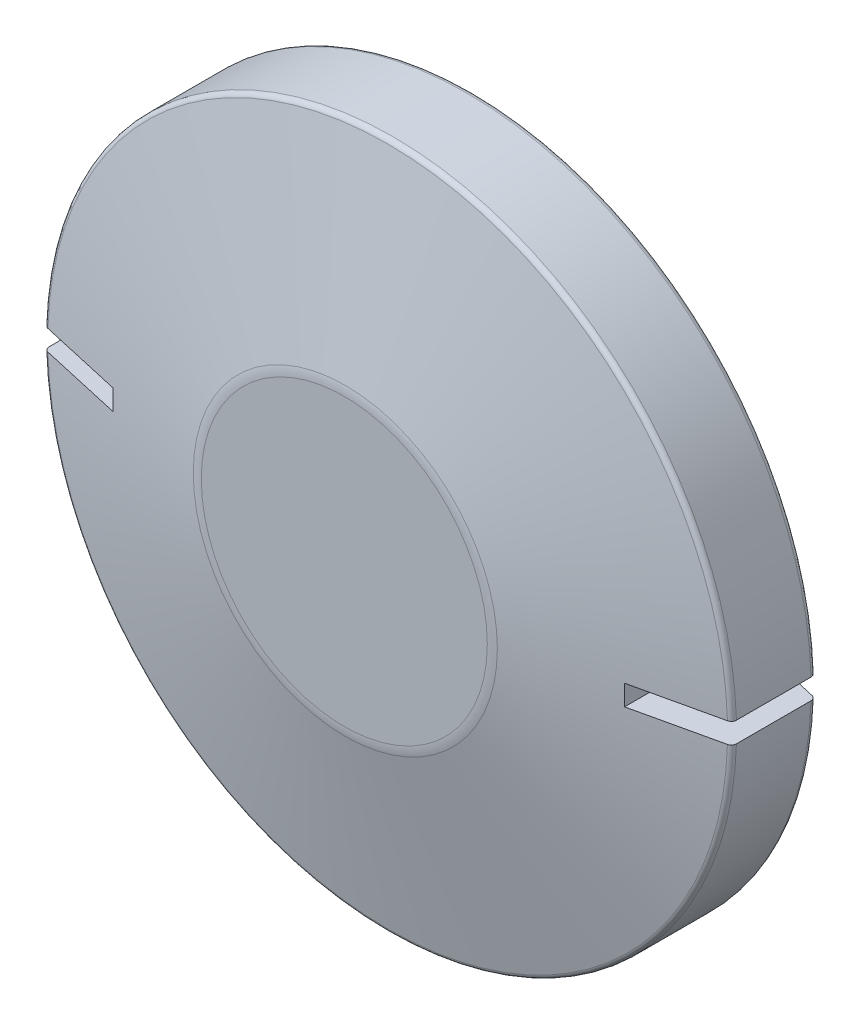
ISO-10303-21;
HEADER;
FILE_DESCRIPTION(('STEP AP214'),'2;1');
FILE_NAME('part.step','',(''),(''),'','','');
FILE_SCHEMA(('AUTOMOTIVE_DESIGN { 1 0 10303 214 1 1 1 1 }'));
ENDSEC;
DATA;
#1=APPLICATION_CONTEXT('core data for automotive mechanical design processes');
#2=APPLICATION_PROTOCOL_DEFINITION('international standard','automotive_design',2000,#1);
#3=PRODUCT_CONTEXT('',#1,'mechanical');
#4=PRODUCT('Part','Part','',(#3));
#5=PRODUCT_RELATED_PRODUCT_CATEGORY('part','',(#4));
#6=PRODUCT_DEFINITION_FORMATION('','',#4);
#7=PRODUCT_DEFINITION_CONTEXT('part definition',#1,'design');
#8=PRODUCT_DEFINITION('design','',#6,#7);
#9=PRODUCT_DEFINITION_SHAPE('','',#8);
#10=(LENGTH_UNIT() NAMED_UNIT(*) SI_UNIT(.MILLI.,.METRE.));
#11=(NAMED_UNIT(*) PLANE_ANGLE_UNIT() SI_UNIT($,.RADIAN.));
#12=(NAMED_UNIT(*) SI_UNIT($,.STERADIAN.) SOLID_ANGLE_UNIT());
#13=UNCERTAINTY_MEASURE_WITH_UNIT(LENGTH_MEASURE(1.E-05),#10,'distance_accuracy_value','');
#14=(GEOMETRIC_REPRESENTATION_CONTEXT(3) GLOBAL_UNCERTAINTY_ASSIGNED_CONTEXT((#13)) GLOBAL_UNIT_ASSIGNED_CONTEXT((#10,
#11,#12)) REPRESENTATION_CONTEXT('',''));
#15=CARTESIAN_POINT('',(0.,0.,0.));
#16=DIRECTION('',(0.,0.,1.));
#17=DIRECTION('',(1.,0.,0.));
#18=AXIS2_PLACEMENT_3D('',#15,#16,#17);
#19=CARTESIAN_POINT('',(-13.9901133160344,-13.9901133160344,16.8));
#20=DIRECTION('',(0.,0.,1.));
#21=DIRECTION('',(1.,0.,0.));
#22=AXIS2_PLACEMENT_3D('',#19,#20,#21);
#23=PLANE('',#22);
#24=CARTESIAN_POINT('',(0.,0.,16.8));
#25=DIRECTION('',(0.,0.,-1.));
#26=DIRECTION('',(-1.,0.,0.));
#27=AXIS2_PLACEMENT_3D('',#24,#25,#26);
#28=CIRCLE('',#27,13.9801133160344);
#29=CARTESIAN_POINT('',(-13.9801133160344,0.,16.8));
#30=VERTEX_POINT('',#29);
#31=EDGE_CURVE('E22',#30,#30,#28,.T.);
#32=ORIENTED_EDGE('',*,*,#31,.F.);
#33=EDGE_LOOP('',(#32));
#34=FACE_BOUND('',#33,.T.);
#35=ADVANCED_FACE('F17',(#34),#23,.T.);
#36=CARTESIAN_POINT('',(14.5457854044398,-14.5457854044398,0.));
#37=DIRECTION('',(0.,0.,-1.));
#38=DIRECTION('',(-1.,0.,0.));
#39=AXIS2_PLACEMENT_3D('',#36,#37,#38);
#40=PLANE('',#39);
#41=CARTESIAN_POINT('',(0.,0.,0.));
#42=DIRECTION('',(0.,0.,-1.));
#43=DIRECTION('',(-1.,0.,0.));
#44=AXIS2_PLACEMENT_3D('',#41,#42,#43);
#45=CIRCLE('',#44,14.5357854044398);
#46=CARTESIAN_POINT('',(-14.5357854044398,0.,0.));
#47=VERTEX_POINT('',#46);
#48=EDGE_CURVE('E244',#47,#47,#45,.F.);
#49=ORIENTED_EDGE('',*,*,#48,.F.);
#50=EDGE_LOOP('',(#49));
#51=FACE_BOUND('',#50,.T.);
#52=ADVANCED_FACE('F486',(#51),#40,.T.);
#53=CARTESIAN_POINT('',(-5.21128131041563E-13,5.74843991851814E-13,4.77559832415817));
#54=DIRECTION('',(0.,0.,1.));
#55=DIRECTION('',(1.,0.,0.));
#56=AXIS2_PLACEMENT_3D('',#53,#54,#55);
#57=CYLINDRICAL_SURFACE('',#56,33.6146574673766);
#58=DIRECTION('',(0.,0.,1.));
#59=VECTOR('',#58,1.);
#60=CARTESIAN_POINT('',(33.5997797108746,1.00000001489884,8.38355223928755));
#61=LINE('',#60,#59);
#62=CARTESIAN_POINT('',(33.5997797108741,1.00000001489884,4.77559832415817));
#63=VERTEX_POINT('',#62);
#64=CARTESIAN_POINT('',(33.5997797108741,1.00000001489884,12.070682298208));
#65=VERTEX_POINT('',#64);
#66=EDGE_CURVE('E256',#63,#65,#61,.T.);
#67=ORIENTED_EDGE('',*,*,#66,.F.);
#68=CARTESIAN_POINT('',(-5.21128131041563E-13,5.74843991851814E-13,4.77559832415817));
#69=DIRECTION('',(0.,0.,-1.));
#70=DIRECTION('',(-1.,0.,0.));
#71=AXIS2_PLACEMENT_3D('',#68,#69,#70);
#72=CIRCLE('',#71,33.6146574673766);
#73=CARTESIAN_POINT('',(-33.5997797108745,1.00000001490116,4.77559832415817));
#74=VERTEX_POINT('',#73);
#75=EDGE_CURVE('E232',#74,#63,#72,.T.);
#76=ORIENTED_EDGE('',*,*,#75,.F.);
#77=DIRECTION('',(0.,0.,-1.));
#78=VECTOR('',#77,1.);
#79=CARTESIAN_POINT('',(-33.5997797108745,1.00000001490116,8.38355223928751));
#80=LINE('',#79,#78);
#81=CARTESIAN_POINT('',(-33.5997797108745,1.00000001490116,12.070682298208));
#82=VERTEX_POINT('',#81);
#83=EDGE_CURVE('E233',#82,#74,#80,.T.);
#84=ORIENTED_EDGE('',*,*,#83,.F.);
#85=CARTESIAN_POINT('',(-5.21128131041563E-13,5.74843991851814E-13,12.070682298208));
#86=DIRECTION('',(0.,0.,1.));
#87=DIRECTION('',(0.,-1.,0.));
#88=AXIS2_PLACEMENT_3D('',#85,#86,#87);
#89=CIRCLE('',#88,33.6146574673766);
#90=EDGE_CURVE('E121',#65,#82,#89,.T.);
#91=ORIENTED_EDGE('',*,*,#90,.F.);
#92=EDGE_LOOP('',(#67,#76,#84,#91));
#93=FACE_BOUND('',#92,.T.);
#94=ADVANCED_FACE('F139',(#93),#57,.T.);
#95=CARTESIAN_POINT('',(25.0000003725464,1.01000001489884,2.34276110825747));
#96=DIRECTION('',(1.,0.,0.));
#97=DIRECTION('',(0.,0.,1.));
#98=AXIS2_PLACEMENT_3D('',#95,#96,#97);
#99=PLANE('',#98);
#100=DIRECTION('',(0.,0.,1.));
#101=VECTOR('',#100,1.);
#102=CARTESIAN_POINT('',(25.0000003725464,-1.00000001490116,8.38355223928755));
#103=LINE('',#102,#101);
#104=CARTESIAN_POINT('',(25.0000003725464,-1.00000001490116,2.35746474966421));
#105=VERTEX_POINT('',#104);
#106=CARTESIAN_POINT('',(25.0000003725464,-1.00000001490116,14.4096397289109));
#107=VERTEX_POINT('',#106);
#108=EDGE_CURVE('E116',#105,#107,#103,.T.);
#109=ORIENTED_EDGE('',*,*,#108,.F.);
#110=CARTESIAN_POINT('',(25.0000003725464,-1.00000001490116,2.35746474966421));
#111=CARTESIAN_POINT('',(25.0000003725464,-0.499800167287828,2.35276110825746));
#112=CARTESIAN_POINT('',(25.0000003725464,0.,2.35276110825746));
#113=B_SPLINE_CURVE_WITH_KNOTS('',2,(#110,#111,#112),.UNSPECIFIED.,.F.,.F.,(3,3),(0.,1.),.UNSPECIFIED.);
#114=CARTESIAN_POINT('',(25.0000003725464,0.,2.35276110825746));
#115=VERTEX_POINT('',#114);
#116=EDGE_CURVE('E104',#105,#115,#113,.T.);
#117=ORIENTED_EDGE('',*,*,#116,.T.);
#118=CARTESIAN_POINT('',(25.0000003725464,0.,2.35276110825746));
#119=CARTESIAN_POINT('',(25.0000003725464,0.499800167286578,2.35276110825746));
#120=CARTESIAN_POINT('',(25.0000003725464,1.00000001489884,2.35746474966419));
#121=B_SPLINE_CURVE_WITH_KNOTS('',2,(#118,#119,#120),.UNSPECIFIED.,.F.,.F.,(3,3),(0.,1.),.UNSPECIFIED.);
#122=CARTESIAN_POINT('',(25.0000003725464,1.00000001489884,2.35746474966419));
#123=VERTEX_POINT('',#122);
#124=EDGE_CURVE('E99',#115,#123,#121,.T.);
#125=ORIENTED_EDGE('',*,*,#124,.T.);
#126=DIRECTION('',(0.,0.,-1.));
#127=VECTOR('',#126,1.);
#128=CARTESIAN_POINT('',(25.0000003725464,1.00000001489884,8.38355223928755));
#129=LINE('',#128,#127);
#130=CARTESIAN_POINT('',(25.0000003725464,1.00000001489884,14.4096397289109));
#131=VERTEX_POINT('',#130);
#132=EDGE_CURVE('E255',#131,#123,#129,.T.);
#133=ORIENTED_EDGE('',*,*,#132,.F.);
#134=CARTESIAN_POINT('',(25.0000003725464,1.00000001489884,14.4096397289109));
#135=CARTESIAN_POINT('',(25.0000003725464,0.499800167286619,14.4141504983543));
#136=CARTESIAN_POINT('',(25.0000003725464,0.,14.4141504983543));
#137=B_SPLINE_CURVE_WITH_KNOTS('',2,(#134,#135,#136),.UNSPECIFIED.,.F.,.F.,(3,3),(0.,1.),.UNSPECIFIED.);
#138=CARTESIAN_POINT('',(25.0000003725464,0.,14.4141504983543));
#139=VERTEX_POINT('',#138);
#140=EDGE_CURVE('E112',#131,#139,#137,.T.);
#141=ORIENTED_EDGE('',*,*,#140,.T.);
#142=CARTESIAN_POINT('',(25.0000003725464,0.,14.4141504983543));
#143=CARTESIAN_POINT('',(25.0000003725464,-0.499800167287662,14.4141504983543));
#144=CARTESIAN_POINT('',(25.0000003725464,-1.00000001490116,14.4096397289109));
#145=B_SPLINE_CURVE_WITH_KNOTS('',2,(#142,#143,#144),.UNSPECIFIED.,.F.,.F.,(3,3),(0.,1.),.UNSPECIFIED.);
#146=EDGE_CURVE('E118',#139,#107,#145,.T.);
#147=ORIENTED_EDGE('',*,*,#146,.T.);
#148=EDGE_LOOP('',(#109,#117,#125,#133,#141,#147));
#149=FACE_BOUND('',#148,.T.);
#150=ADVANCED_FACE('F114',(#149),#99,.T.);
#151=CARTESIAN_POINT('',(0.,0.,12.8000000000013));
#152=DIRECTION('',(0.,0.,-1.));
#153=DIRECTION('',(-1.,0.,0.));
#154=AXIS2_PLACEMENT_3D('',#151,#152,#153);
#155=TOROIDAL_SURFACE('',#154,13.9801133160344,3.99999999999868);
#156=ORIENTED_EDGE('',*,*,#31,.T.);
#157=EDGE_LOOP('',(#156));
#158=FACE_BOUND('',#157,.T.);
#159=CARTESIAN_POINT('',(0.,0.,16.7019130107347));
#160=DIRECTION('',(0.,0.,-1.));
#161=DIRECTION('',(-1.,0.,0.));
#162=AXIS2_PLACEMENT_3D('',#159,#160,#161);
#163=CIRCLE('',#162,14.8604966738161);
#164=CARTESIAN_POINT('',(-14.8604966738161,0.,16.7019130107347));
#165=VERTEX_POINT('',#164);
#166=EDGE_CURVE('E279',#165,#165,#163,.T.);
#167=ORIENTED_EDGE('',*,*,#166,.F.);
#168=EDGE_LOOP('',(#167));
#169=FACE_BOUND('',#168,.T.);
#170=ADVANCED_FACE('F138',(#158,#169),#155,.T.);
#171=CARTESIAN_POINT('',(-5.20417042793042E-13,5.74843991851814E-13,12.070682298208));
#172=DIRECTION('',(0.,0.,-1.));
#173=DIRECTION('',(0.,1.,0.));
#174=AXIS2_PLACEMENT_3D('',#171,#172,#173);
#175=TOROIDAL_SURFACE('',#174,33.1146574673767,0.49999999999997);
#176=CARTESIAN_POINT('',(33.5997797108735,1.00000001489884,12.070682298208));
#177=CARTESIAN_POINT('',(33.5998036411843,1.00000001489884,12.0987974873725));
#178=CARTESIAN_POINT('',(33.5974087018389,1.00000001489884,12.1269055090971));
#179=CARTESIAN_POINT('',(33.5879560954145,1.00000001489884,12.182314317645));
#180=CARTESIAN_POINT('',(33.5809005339088,1.00000001489884,12.209615463182));
#181=CARTESIAN_POINT('',(33.5622975649654,1.00000001489884,12.262655358059));
#182=CARTESIAN_POINT('',(33.5507483047452,1.00000001489884,12.2883934578777));
#183=CARTESIAN_POINT('',(33.5234996511045,1.00000001489884,12.3375562803488));
#184=CARTESIAN_POINT('',(33.5078018834796,1.00000001489884,12.3609819043291));
#185=CARTESIAN_POINT('',(33.4726945059987,1.00000001489884,12.4048708936602));
#186=CARTESIAN_POINT('',(33.4532841807297,1.00000001489884,12.4253336867333));
#187=CARTESIAN_POINT('',(33.4112977368955,1.00000001489884,12.4627215272342));
#188=CARTESIAN_POINT('',(33.3887203588792,1.00000001489884,12.4796451605321));
#189=CARTESIAN_POINT('',(33.3410546377919,1.00000001489884,12.509451327606));
#190=CARTESIAN_POINT('',(33.315967436427,1.00000001489884,12.5223356879004));
#191=CARTESIAN_POINT('',(33.2639844027937,1.00000001489884,12.5437401944271));
#192=CARTESIAN_POINT('',(33.23708781653,1.00000001489884,12.5522585083644));
#193=CARTESIAN_POINT('',(33.2096529344976,1.00000001489884,12.5584214245496));
#194=B_SPLINE_CURVE_WITH_KNOTS('',3,(#176,#177,#178,#179,#180,#181,#182,#183,#184,#185,#186,
#187,#188,#189,#190,#191,#192,#193),.UNSPECIFIED.,.F.,.F.,(4,2,2,2,2,2,2,2,4),(0.,
0.0842334945062174,0.168428960054133,0.252659176811951,0.336856432661474,0.421069929773242,
0.505317011759473,0.589525942935058,0.673770185124642),.UNSPECIFIED.);
#195=CARTESIAN_POINT('',(33.2096529344976,1.00000001489884,12.5584214245497));
#196=VERTEX_POINT('',#195);
#197=EDGE_CURVE('E250',#65,#196,#194,.T.);
#198=ORIENTED_EDGE('',*,*,#197,.F.);
#199=ORIENTED_EDGE('',*,*,#90,.T.);
#200=CARTESIAN_POINT('',(-33.2096529344975,1.00000001490116,12.5584214245498));
#201=CARTESIAN_POINT('',(-33.2371092020699,1.00000001490116,12.5522537619499));
#202=CARTESIAN_POINT('',(-33.264026304747,1.00000001490116,12.5437269633244));
#203=CARTESIAN_POINT('',(-33.3160469141865,1.00000001490116,12.5222989647473));
#204=CARTESIAN_POINT('',(-33.3411511817215,1.00000001490116,12.5093996128711));
#205=CARTESIAN_POINT('',(-33.3888453834416,1.00000001490116,12.4795582619922));
#206=CARTESIAN_POINT('',(-33.4114342451954,1.00000001490116,12.4626145482993));
#207=CARTESIAN_POINT('',(-33.4534375451766,1.00000001490116,12.4251824540357));
#208=CARTESIAN_POINT('',(-33.4728532444857,1.00000001490116,12.4046954883235));
#209=CARTESIAN_POINT('',(-33.5079626293777,1.00000001490116,12.360757705808));
#210=CARTESIAN_POINT('',(-33.5236573794788,1.00000001490116,12.3373077396332));
#211=CARTESIAN_POINT('',(-33.550893053783,1.00000001490116,12.2880958249099));
#212=CARTESIAN_POINT('',(-33.562432367737,1.00000001490116,12.2623329849337));
#213=CARTESIAN_POINT('',(-33.5809823955278,1.00000001490116,12.2093196143799));
#214=CARTESIAN_POINT('',(-33.5880075548878,1.00000001490116,12.1820741350028));
#215=CARTESIAN_POINT('',(-33.5974190415515,1.00000001490116,12.1267825011437));
#216=CARTESIAN_POINT('',(-33.5998033858346,1.00000001490116,12.0987360095806));
#217=CARTESIAN_POINT('',(-33.5997797108745,1.00000001490116,12.070682298208));
#218=B_SPLINE_CURVE_WITH_KNOTS('',3,(#200,#201,#202,#203,#204,#205,#206,#207,#208,#209,#210,
#211,#212,#213,#214,#215,#216,#217),.UNSPECIFIED.,.F.,.F.,(4,2,2,2,2,2,2,2,4),(0.,
0.0843096839848787,0.168583778514145,0.252893666437171,0.337169965920442,0.421422125804898,
0.5057068987125,0.589720594904672,0.673770182281393),.UNSPECIFIED.);
#219=CARTESIAN_POINT('',(-33.2096529344975,1.00000001490116,12.5584214245498));
#220=VERTEX_POINT('',#219);
#221=EDGE_CURVE('E239',#220,#82,#218,.T.);
#222=ORIENTED_EDGE('',*,*,#221,.F.);
#223=CARTESIAN_POINT('',(0.,0.,12.5584214245498));
#224=DIRECTION('',(0.,0.,1.));
#225=DIRECTION('',(1.,0.,0.));
#226=AXIS2_PLACEMENT_3D('',#223,#224,#225);
#227=CIRCLE('',#226,33.2247053870999);
#228=EDGE_CURVE('E278',#196,#220,#227,.T.);
#229=ORIENTED_EDGE('',*,*,#228,.F.);
#230=EDGE_LOOP('',(#198,#199,#222,#229));
#231=FACE_BOUND('',#230,.T.);
#232=ADVANCED_FACE('F245',(#231),#175,.T.);
#233=CARTESIAN_POINT('',(0.,0.,3.99999999999944));
#234=DIRECTION('',(0.,0.,-1.));
#235=DIRECTION('',(-1.,0.,0.));
#236=AXIS2_PLACEMENT_3D('',#233,#234,#235);
#237=TOROIDAL_SURFACE('',#236,14.5357854044398,3.99999999999944);
#238=CARTESIAN_POINT('',(0.,0.,0.106315687900462));
#239=DIRECTION('',(0.,0.,1.));
#240=DIRECTION('',(1.,0.,0.));
#241=AXIS2_PLACEMENT_3D('',#238,#239,#240);
#242=CIRCLE('',#241,15.4518762720451);
#243=CARTESIAN_POINT('',(15.4518762720451,0.,0.106315687900462));
#244=VERTEX_POINT('',#243);
#245=EDGE_CURVE('E306',#244,#244,#242,.T.);
#246=ORIENTED_EDGE('',*,*,#245,.F.);
#247=EDGE_LOOP('',(#246));
#248=FACE_BOUND('',#247,.T.);
#249=ORIENTED_EDGE('',*,*,#48,.T.);
#250=EDGE_LOOP('',(#249));
#251=FACE_BOUND('',#250,.T.);
#252=ADVANCED_FACE('F212',(#248,#251),#237,.T.);
#253=CARTESIAN_POINT('',(-33.6097797108745,1.00000001490116,14.4196397289119));
#254=DIRECTION('',(0.,-1.,0.));
#255=DIRECTION('',(0.,0.,-1.));
#256=AXIS2_PLACEMENT_3D('',#253,#254,#255);
#257=PLANE('',#256);
#258=CARTESIAN_POINT('',(-25.0000003725418,1.00000001490116,2.35746474966313));
#259=CARTESIAN_POINT('',(-26.3690322165509,1.00000001490116,2.67931681704533));
#260=CARTESIAN_POINT('',(-27.7380579738806,1.00000001490116,3.0011947703681));
#261=CARTESIAN_POINT('',(-30.4760973150437,1.00000001490116,3.64500244886231));
#262=CARTESIAN_POINT('',(-31.845110898877,1.00000001490116,3.96693217403374));
#263=CARTESIAN_POINT('',(-33.214118396031,1.00000001490116,4.28888778514573));
#264=B_SPLINE_CURVE_WITH_KNOTS('',3,(#258,#259,#260,#261,#262,#263),.UNSPECIFIED.,.F.,.F.,(4,2,
4),(0.,4.21906772517446,8.43813544992375),.UNSPECIFIED.);
#265=CARTESIAN_POINT('',(-25.0000003725418,1.00000001490116,2.35746474966313));
#266=VERTEX_POINT('',#265);
#267=CARTESIAN_POINT('',(-33.214118396031,1.00000001490116,4.28888778514573));
#268=VERTEX_POINT('',#267);
#269=EDGE_CURVE('E195',#266,#268,#264,.T.);
#270=ORIENTED_EDGE('',*,*,#269,.F.);
#271=DIRECTION('',(0.,0.,-1.));
#272=VECTOR('',#271,1.);
#273=CARTESIAN_POINT('',(-25.0000003725418,1.00000001490116,8.38335944438054));
#274=LINE('',#273,#272);
#275=CARTESIAN_POINT('',(-25.0000003725418,1.00000001490116,14.4096397289119));
#276=VERTEX_POINT('',#275);
#277=EDGE_CURVE('E301',#276,#266,#274,.T.);
#278=ORIENTED_EDGE('',*,*,#277,.F.);
#279=CARTESIAN_POINT('',(-33.2096529344975,1.00000001490116,12.5584214245498));
#280=CARTESIAN_POINT('',(-31.8413887405268,1.00000001490116,12.867007623727));
#281=CARTESIAN_POINT('',(-30.4731189300771,1.00000001490116,13.1755689153385));
#282=CARTESIAN_POINT('',(-27.7365680760918,1.00000001490116,13.7926416834592));
#283=CARTESIAN_POINT('',(-26.3682870325563,1.00000001490116,14.1011531599684));
#284=CARTESIAN_POINT('',(-25.0000003725418,1.00000001490116,14.4096397289119));
#285=B_SPLINE_CURVE_WITH_KNOTS('',3,(#279,#280,#281,#282,#283,#284),.UNSPECIFIED.,.F.,.F.,(4,2,
4),(0.,4.2078915270979,8.41578305458864),.UNSPECIFIED.);
#286=EDGE_CURVE('E218',#220,#276,#285,.T.);
#287=ORIENTED_EDGE('',*,*,#286,.F.);
#288=ORIENTED_EDGE('',*,*,#221,.T.);
#289=ORIENTED_EDGE('',*,*,#83,.T.);
#290=CARTESIAN_POINT('',(-33.214118396031,1.00000001490116,4.28888778514573));
#291=CARTESIAN_POINT('',(-33.2415169656082,1.00000001490116,4.29530658537068));
#292=CARTESIAN_POINT('',(-33.268354790398,1.00000001490116,4.30407949669645));
#293=CARTESIAN_POINT('',(-33.3201764680411,1.00000001490116,4.32598278264256));
#294=CARTESIAN_POINT('',(-33.345161125821,1.00000001490116,4.33911125169522));
#295=CARTESIAN_POINT('',(-33.3925792373398,1.00000001490116,4.36938752437649));
#296=CARTESIAN_POINT('',(-33.4150116051158,1.00000001490116,4.38653702946992));
#297=CARTESIAN_POINT('',(-33.4566700215578,1.00000001490116,4.42435178343595));
#298=CARTESIAN_POINT('',(-33.4758972906981,1.00000001490116,4.44501568797173));
#299=CARTESIAN_POINT('',(-33.5106030531231,1.00000001490116,4.48927327807426));
#300=CARTESIAN_POINT('',(-33.5260825643278,1.00000001490116,4.51286616546714));
#301=CARTESIAN_POINT('',(-33.5528659062367,1.00000001490116,4.5623253964172));
#302=CARTESIAN_POINT('',(-33.5641683289771,1.00000001490116,4.58819250291119));
#303=CARTESIAN_POINT('',(-33.5819881713163,1.00000001490116,4.64065342290162));
#304=CARTESIAN_POINT('',(-33.5886394469579,1.00000001490116,4.66720188906132));
#305=CARTESIAN_POINT('',(-33.5975460161338,1.00000001490116,4.72103042549658));
#306=CARTESIAN_POINT('',(-33.5998004886833,1.00000001490116,4.74831063144104));
#307=CARTESIAN_POINT('',(-33.5997797108745,1.00000001490116,4.77559832415817));
#308=B_SPLINE_CURVE_WITH_KNOTS('',3,(#290,#291,#292,#293,#294,#295,#296,#297,#298,#299,#300,
#301,#302,#303,#304,#305,#306,#307),.UNSPECIFIED.,.F.,.F.,(4,2,2,2,2,2,2,2,4),(0.,
0.0843094697697556,0.168582102465188,0.252890458917498,0.337166637765024,0.421419900809214,
0.505701537106035,0.587444908923046,0.669203542658757),.UNSPECIFIED.);
#309=EDGE_CURVE('E226',#268,#74,#308,.T.);
#310=ORIENTED_EDGE('',*,*,#309,.F.);
#311=EDGE_LOOP('',(#270,#278,#287,#288,#289,#310));
#312=FACE_BOUND('',#311,.T.);
#313=ADVANCED_FACE('F206',(#312),#257,.T.);
#314=CARTESIAN_POINT('',(-6.10622663543836E-13,5.28656979303932E-13,4.77559832415817));
#315=DIRECTION('',(0.,0.,-1.));
#316=DIRECTION('',(-1.,0.,0.));
#317=AXIS2_PLACEMENT_3D('',#314,#315,#316);
#318=TOROIDAL_SURFACE('',#317,33.1146574673766,0.499999999999987);
#319=CARTESIAN_POINT('',(33.214118396031,1.00000001489884,4.288887785146));
#320=CARTESIAN_POINT('',(33.2415169656082,1.00000001489884,4.29530658537101));
#321=CARTESIAN_POINT('',(33.268354790398,1.00000001489884,4.30407949669685));
#322=CARTESIAN_POINT('',(33.320176468041,1.00000001489884,4.32598278264308));
#323=CARTESIAN_POINT('',(33.3451611258209,1.00000001489884,4.3391112516958));
#324=CARTESIAN_POINT('',(33.3925792373396,1.00000001489884,4.36938752437718));
#325=CARTESIAN_POINT('',(33.4150116051155,1.00000001489884,4.38653702947067));
#326=CARTESIAN_POINT('',(33.4566700215575,1.00000001489884,4.4243517834368));
#327=CARTESIAN_POINT('',(33.4758972906977,1.00000001489884,4.44501568797261));
#328=CARTESIAN_POINT('',(33.5106030531226,1.00000001489884,4.48927327807523));
#329=CARTESIAN_POINT('',(33.5260825643273,1.00000001489884,4.51286616546814));
#330=CARTESIAN_POINT('',(33.5528659062361,1.00000001489884,4.56232539641827));
#331=CARTESIAN_POINT('',(33.5641683289764,1.00000001489884,4.58819250291229));
#332=CARTESIAN_POINT('',(33.5819881713154,1.00000001489884,4.64065342290257));
#333=CARTESIAN_POINT('',(33.5886394469569,1.00000001489884,4.66720188906209));
#334=CARTESIAN_POINT('',(33.5975460161327,1.00000001489884,4.72103042549698));
#335=CARTESIAN_POINT('',(33.5998004886821,1.00000001489884,4.74831063144124));
#336=CARTESIAN_POINT('',(33.5997797108734,1.00000001489884,4.77559832415817));
#337=B_SPLINE_CURVE_WITH_KNOTS('',3,(#319,#320,#321,#322,#323,#324,#325,#326,#327,#328,#329,
#330,#331,#332,#333,#334,#335,#336),.UNSPECIFIED.,.F.,.F.,(4,2,2,2,2,2,2,2,4),(0.,
0.0843094697697549,0.168582102465183,0.252890458917496,0.337166637765015,0.421419900809208,
0.505701537106033,0.587444908922458,0.669203542657578),.UNSPECIFIED.);
#338=CARTESIAN_POINT('',(33.214118396031,1.00000001489884,4.28888778514587));
#339=VERTEX_POINT('',#338);
#340=EDGE_CURVE('E234',#339,#63,#337,.T.);
#341=ORIENTED_EDGE('',*,*,#340,.F.);
#342=CARTESIAN_POINT('',(0.,0.,4.28888778514573));
#343=DIRECTION('',(0.,0.,-1.));
#344=DIRECTION('',(-1.,0.,0.));
#345=AXIS2_PLACEMENT_3D('',#342,#343,#344);
#346=CIRCLE('',#345,33.2291688258278);
#347=EDGE_CURVE('E201',#268,#339,#346,.T.);
#348=ORIENTED_EDGE('',*,*,#347,.F.);
#349=ORIENTED_EDGE('',*,*,#309,.T.);
#350=ORIENTED_EDGE('',*,*,#75,.T.);
#351=EDGE_LOOP('',(#341,#348,#349,#350));
#352=FACE_BOUND('',#351,.T.);
#353=ADVANCED_FACE('F211',(#352),#318,.T.);
#354=CARTESIAN_POINT('',(33.6097797108746,1.00000001489884,2.34746474966419));
#355=DIRECTION('',(0.,-1.,0.));
#356=DIRECTION('',(0.,0.,1.));
#357=AXIS2_PLACEMENT_3D('',#354,#355,#356);
#358=PLANE('',#357);
#359=CARTESIAN_POINT('',(25.0000003725464,1.00000001489884,14.4096397289109));
#360=CARTESIAN_POINT('',(26.3682870325602,1.00000001489884,14.1011531599675));
#361=CARTESIAN_POINT('',(27.7365680760949,1.00000001489884,13.7926416834585));
#362=CARTESIAN_POINT('',(30.4731189300787,1.00000001489884,13.1755689153382));
#363=CARTESIAN_POINT('',(31.8413887405277,1.00000001489884,12.8670076237268));
#364=CARTESIAN_POINT('',(33.2096529344976,1.00000001489884,12.5584214245498));
#365=B_SPLINE_CURVE_WITH_KNOTS('',3,(#359,#360,#361,#362,#363,#364),.UNSPECIFIED.,.F.,.F.,(4,2,
4),(0.,4.20789152748843,8.41578305458401),.UNSPECIFIED.);
#366=EDGE_CURVE('E272',#131,#196,#365,.T.);
#367=ORIENTED_EDGE('',*,*,#366,.F.);
#368=ORIENTED_EDGE('',*,*,#132,.T.);
#369=CARTESIAN_POINT('',(33.2141183960311,1.00000001489884,4.28888778514573));
#370=CARTESIAN_POINT('',(31.8451108988778,1.00000001489884,3.96693217403392));
#371=CARTESIAN_POINT('',(30.4760973150453,1.00000001489884,3.64500244886266));
#372=CARTESIAN_POINT('',(27.7380579738837,1.00000001489884,3.0011947703688));
#373=CARTESIAN_POINT('',(26.3690322165547,1.00000001489884,2.67931681704622));
#374=CARTESIAN_POINT('',(25.0000003725464,1.00000001489884,2.35746474966419));
#375=B_SPLINE_CURVE_WITH_KNOTS('',3,(#369,#370,#371,#372,#373,#374),.UNSPECIFIED.,.F.,.F.,(4,2,
4),(0.,4.21906772474696,8.43813544991909),.UNSPECIFIED.);
#376=EDGE_CURVE('E108',#339,#123,#375,.T.);
#377=ORIENTED_EDGE('',*,*,#376,.F.);
#378=ORIENTED_EDGE('',*,*,#340,.T.);
#379=ORIENTED_EDGE('',*,*,#66,.T.);
#380=ORIENTED_EDGE('',*,*,#197,.T.);
#381=EDGE_LOOP('',(#367,#368,#377,#378,#379,#380));
#382=FACE_BOUND('',#381,.T.);
#383=ADVANCED_FACE('F263',(#382),#358,.T.);
#384=CARTESIAN_POINT('',(6.10622663543836E-13,-5.28656979303932E-13,4.77559832415817));
#385=DIRECTION('',(0.,0.,-1.));
#386=DIRECTION('',(-1.,0.,0.));
#387=AXIS2_PLACEMENT_3D('',#384,#385,#386);
#388=TOROIDAL_SURFACE('',#387,33.1146574673766,0.499999999999988);
#389=CARTESIAN_POINT('',(33.5997797108745,-1.00000001490116,4.77559832415817));
#390=CARTESIAN_POINT('',(33.5998036460459,-1.00000001490116,4.7474829254751));
#391=CARTESIAN_POINT('',(33.597408668477,-1.00000001490116,4.7193746938985));
#392=CARTESIAN_POINT('',(33.5879559879131,-1.00000001490116,4.66396589654604));
#393=CARTESIAN_POINT('',(33.5809004598778,-1.00000001490116,4.63666496023214));
#394=CARTESIAN_POINT('',(33.5622976478804,-1.00000001490116,4.58362548857816));
#395=CARTESIAN_POINT('',(33.5507485154428,-1.00000001490116,4.55788760125276));
#396=CARTESIAN_POINT('',(33.5234998995367,-1.00000001490116,4.50872473369079));
#397=CARTESIAN_POINT('',(33.5078019721402,-1.00000001490116,4.48529889079994));
#398=CARTESIAN_POINT('',(33.4726941221774,-1.00000001490116,4.44140918693668));
#399=CARTESIAN_POINT('',(33.453283421856,-1.00000001490116,4.42094594815413));
#400=CARTESIAN_POINT('',(33.4112963716062,-1.00000001490116,4.38355819130071));
#401=CARTESIAN_POINT('',(33.3887189211881,-1.00000001490116,4.36663490852918));
#402=CARTESIAN_POINT('',(33.3416986073237,-1.00000001490116,4.33723164337083));
#403=CARTESIAN_POINT('',(33.3173238322121,-1.00000001490116,4.3246425906766));
#404=CARTESIAN_POINT('',(33.2668489335208,-1.00000001490116,4.30359086555295));
#405=CARTESIAN_POINT('',(33.2407485014051,-1.00000001490116,4.29512893330349));
#406=CARTESIAN_POINT('',(33.214118396031,-1.00000001490116,4.28888778514573));
#407=B_SPLINE_CURVE_WITH_KNOTS('',3,(#389,#390,#391,#392,#393,#394,#395,#396,#397,#398,#399,
#400,#401,#402,#403,#404,#405,#406),.UNSPECIFIED.,.F.,.F.,(4,2,2,2,2,2,2,2,4),(0.,
0.0842341211088895,0.168428960051868,0.252658469807503,0.336856432661783,0.421072052738532,
0.505317011763194,0.587252959202624,0.669203596076486),.UNSPECIFIED.);
#408=CARTESIAN_POINT('',(33.5997797108745,-1.00000001490116,4.77559832415817));
#409=VERTEX_POINT('',#408);
#410=CARTESIAN_POINT('',(33.214118396031,-1.00000001490116,4.28888778514573));
#411=VERTEX_POINT('',#410);
#412=EDGE_CURVE('E334',#409,#411,#407,.T.);
#413=ORIENTED_EDGE('',*,*,#412,.F.);
#414=CARTESIAN_POINT('',(5.21128131041563E-13,-5.74843991851814E-13,4.77559832415817));
#415=DIRECTION('',(0.,0.,1.));
#416=DIRECTION('',(1.,0.,0.));
#417=AXIS2_PLACEMENT_3D('',#414,#415,#416);
#418=CIRCLE('',#417,33.6146574673766);
#419=CARTESIAN_POINT('',(-33.599779710874,-1.00000001489884,4.77559832415817));
#420=VERTEX_POINT('',#419);
#421=EDGE_CURVE('E329',#420,#409,#418,.T.);
#422=ORIENTED_EDGE('',*,*,#421,.F.);
#423=CARTESIAN_POINT('',(-33.5997797108734,-1.00000001489884,4.77559832415817));
#424=CARTESIAN_POINT('',(-33.5998036460447,-1.00000001489884,4.7474829254751));
#425=CARTESIAN_POINT('',(-33.5974086684758,-1.00000001489884,4.7193746938985));
#426=CARTESIAN_POINT('',(-33.5879559879119,-1.00000001489884,4.66396589654604));
#427=CARTESIAN_POINT('',(-33.5809004598767,-1.00000001489884,4.63666496023214));
#428=CARTESIAN_POINT('',(-33.5622976478793,-1.00000001489884,4.58362548857816));
#429=CARTESIAN_POINT('',(-33.5507485154416,-1.00000001489884,4.55788760125276));
#430=CARTESIAN_POINT('',(-33.5234998995356,-1.00000001489884,4.5087247336908));
#431=CARTESIAN_POINT('',(-33.5078019721391,-1.00000001489884,4.48529889079994));
#432=CARTESIAN_POINT('',(-33.4726941221762,-1.00000001489884,4.44140918693669));
#433=CARTESIAN_POINT('',(-33.4532834218548,-1.00000001489884,4.42094594815413));
#434=CARTESIAN_POINT('',(-33.4112963716051,-1.00000001489884,4.38355819130071));
#435=CARTESIAN_POINT('',(-33.388718921187,-1.00000001489884,4.36663490852918));
#436=CARTESIAN_POINT('',(-33.3416986073227,-1.00000001489884,4.33723164337094));
#437=CARTESIAN_POINT('',(-33.3173238322113,-1.00000001489884,4.32464259067678));
#438=CARTESIAN_POINT('',(-33.2668489335204,-1.00000001489884,4.30359086555322));
#439=CARTESIAN_POINT('',(-33.2407485014049,-1.00000001489884,4.29512893330377));
#440=CARTESIAN_POINT('',(-33.214118396031,-1.00000001489884,4.288887785146));
#441=B_SPLINE_CURVE_WITH_KNOTS('',3,(#423,#424,#425,#426,#427,#428,#429,#430,#431,#432,#433,
#434,#435,#436,#437,#438,#439,#440),.UNSPECIFIED.,.F.,.F.,(4,2,2,2,2,2,2,2,4),(0.,
0.0842341211088886,0.168428960051866,0.252658469807501,0.336856432661782,0.421072052738527,
0.505317011763192,0.587252959202034,0.669203596075308),.UNSPECIFIED.);
#442=CARTESIAN_POINT('',(-33.214118396031,-1.00000001489884,4.28888778514587));
#443=VERTEX_POINT('',#442);
#444=EDGE_CURVE('E257',#420,#443,#441,.T.);
#445=ORIENTED_EDGE('',*,*,#444,.T.);
#446=CARTESIAN_POINT('',(0.,0.,4.28888778514573));
#447=DIRECTION('',(0.,0.,-1.));
#448=DIRECTION('',(-1.,0.,0.));
#449=AXIS2_PLACEMENT_3D('',#446,#447,#448);
#450=CIRCLE('',#449,33.2291688258278);
#451=EDGE_CURVE('E342',#411,#443,#450,.T.);
#452=ORIENTED_EDGE('',*,*,#451,.F.);
#453=EDGE_LOOP('',(#413,#422,#445,#452));
#454=FACE_BOUND('',#453,.T.);
#455=ADVANCED_FACE('F266',(#454),#388,.T.);
#456=CARTESIAN_POINT('',(33.6097797108745,-1.00000001490116,14.4196397289109));
#457=DIRECTION('',(0.,1.,0.));
#458=DIRECTION('',(0.,0.,-1.));
#459=AXIS2_PLACEMENT_3D('',#456,#457,#458);
#460=PLANE('',#459);
#461=DIRECTION('',(0.,0.,1.));
#462=VECTOR('',#461,1.);
#463=CARTESIAN_POINT('',(33.5997797108745,-1.00000001490116,8.42314031118309));
#464=LINE('',#463,#462);
#465=CARTESIAN_POINT('',(33.5997797108745,-1.00000001490116,12.070682298208));
#466=VERTEX_POINT('',#465);
#467=EDGE_CURVE('E325',#409,#466,#464,.T.);
#468=ORIENTED_EDGE('',*,*,#467,.F.);
#469=ORIENTED_EDGE('',*,*,#412,.T.);
#470=CARTESIAN_POINT('',(25.0000003725464,-1.00000001490116,2.35746474966421));
#471=CARTESIAN_POINT('',(26.3690322165547,-1.00000001490116,2.67931681704623));
#472=CARTESIAN_POINT('',(27.7380579738837,-1.00000001490116,3.00119477036882));
#473=CARTESIAN_POINT('',(30.4760973150452,-1.00000001490116,3.64500244886267));
#474=CARTESIAN_POINT('',(31.8451108988778,-1.00000001490116,3.96693217403392));
#475=CARTESIAN_POINT('',(33.214118396031,-1.00000001490116,4.28888778514573));
#476=B_SPLINE_CURVE_WITH_KNOTS('',3,(#470,#471,#472,#473,#474,#475),.UNSPECIFIED.,.F.,.F.,(4,2,
4),(0.,4.2190677251721,8.43813544991903),.UNSPECIFIED.);
#477=EDGE_CURVE('E181',#105,#411,#476,.T.);
#478=ORIENTED_EDGE('',*,*,#477,.F.);
#479=ORIENTED_EDGE('',*,*,#108,.T.);
#480=CARTESIAN_POINT('',(33.2096529344975,-1.00000001490116,12.5584214245498));
#481=CARTESIAN_POINT('',(31.8413887405276,-1.00000001490116,12.8670076237268));
#482=CARTESIAN_POINT('',(30.4731189300786,-1.00000001490116,13.1755689153382));
#483=CARTESIAN_POINT('',(27.7365680760949,-1.00000001490116,13.7926416834585));
#484=CARTESIAN_POINT('',(26.3682870325602,-1.00000001490116,14.1011531599675));
#485=CARTESIAN_POINT('',(25.0000003725464,-1.00000001490116,14.4096397289109));
#486=B_SPLINE_CURVE_WITH_KNOTS('',3,(#480,#481,#482,#483,#484,#485),.UNSPECIFIED.,.F.,.F.,(4,2,
4),(0.,4.20789152709554,8.41578305458393),.UNSPECIFIED.);
#487=CARTESIAN_POINT('',(33.2096529344975,-1.00000001490116,12.5584214245498));
#488=VERTEX_POINT('',#487);
#489=EDGE_CURVE('E280',#488,#107,#486,.T.);
#490=ORIENTED_EDGE('',*,*,#489,.F.);
#491=CARTESIAN_POINT('',(33.5997797108745,-1.00000001490116,12.070682298208));
#492=CARTESIAN_POINT('',(33.5998036411853,-1.00000001490116,12.0987974873725));
#493=CARTESIAN_POINT('',(33.5974087018398,-1.00000001490116,12.1269055090971));
#494=CARTESIAN_POINT('',(33.5879560954154,-1.00000001490116,12.182314317645));
#495=CARTESIAN_POINT('',(33.5809005339098,-1.00000001490116,12.209615463182));
#496=CARTESIAN_POINT('',(33.5622975649664,-1.00000001490116,12.262655358059));
#497=CARTESIAN_POINT('',(33.5507483047462,-1.00000001490116,12.2883934578777));
#498=CARTESIAN_POINT('',(33.5234996511054,-1.00000001490116,12.3375562803488));
#499=CARTESIAN_POINT('',(33.5078018834805,-1.00000001490116,12.3609819043291));
#500=CARTESIAN_POINT('',(33.4726945059997,-1.00000001490116,12.4048708936602));
#501=CARTESIAN_POINT('',(33.4532841807306,-1.00000001490116,12.4253336867333));
#502=CARTESIAN_POINT('',(33.4112977368965,-1.00000001490116,12.4627215272342));
#503=CARTESIAN_POINT('',(33.3887203588802,-1.00000001490116,12.4796451605321));
#504=CARTESIAN_POINT('',(33.3410546377928,-1.00000001490116,12.5094513276061));
#505=CARTESIAN_POINT('',(33.3159674364277,-1.00000001490116,12.5223356879005));
#506=CARTESIAN_POINT('',(33.263984402794,-1.00000001490116,12.5437401944273));
#507=CARTESIAN_POINT('',(33.2370878165302,-1.00000001490116,12.5522585083647));
#508=CARTESIAN_POINT('',(33.2096529344975,-1.00000001490116,12.5584214245498));
#509=B_SPLINE_CURVE_WITH_KNOTS('',3,(#491,#492,#493,#494,#495,#496,#497,#498,#499,#500,#501,
#502,#503,#504,#505,#506,#507,#508),.UNSPECIFIED.,.F.,.F.,(4,2,2,2,2,2,2,2,4),(0.,
0.0842334945062202,0.168428960054136,0.252659176811959,0.336856432661484,0.421069929773255,
0.505317011759485,0.589525942935574,0.673770185125671),.UNSPECIFIED.);
#510=EDGE_CURVE('E324',#466,#488,#509,.T.);
#511=ORIENTED_EDGE('',*,*,#510,.F.);
#512=EDGE_LOOP('',(#468,#469,#478,#479,#490,#511));
#513=FACE_BOUND('',#512,.T.);
#514=ADVANCED_FACE('F371',(#513),#460,.T.);
#515=CARTESIAN_POINT('',(5.20417042793042E-13,-5.74843991851814E-13,12.070682298208));
#516=DIRECTION('',(0.,0.,-1.));
#517=DIRECTION('',(0.,1.,0.));
#518=AXIS2_PLACEMENT_3D('',#515,#516,#517);
#519=TOROIDAL_SURFACE('',#518,33.1146574673767,0.49999999999997);
#520=ORIENTED_EDGE('',*,*,#510,.T.);
#521=CARTESIAN_POINT('',(0.,0.,12.5584214245498));
#522=DIRECTION('',(0.,0.,1.));
#523=DIRECTION('',(1.,0.,0.));
#524=AXIS2_PLACEMENT_3D('',#521,#522,#523);
#525=CIRCLE('',#524,33.2247053870999);
#526=CARTESIAN_POINT('',(-33.2096529344976,-1.00000001489884,12.5584214245497));
#527=VERTEX_POINT('',#526);
#528=EDGE_CURVE('E321',#527,#488,#525,.T.);
#529=ORIENTED_EDGE('',*,*,#528,.F.);
#530=CARTESIAN_POINT('',(-33.2096529344976,-1.00000001489884,12.5584214245496));
#531=CARTESIAN_POINT('',(-33.2371092020699,-1.00000001489884,12.5522537619496));
#532=CARTESIAN_POINT('',(-33.264026304747,-1.00000001489884,12.5437269633241));
#533=CARTESIAN_POINT('',(-33.3160469141864,-1.00000001489884,12.5222989647468));
#534=CARTESIAN_POINT('',(-33.3411511817215,-1.00000001489884,12.5093996128706));
#535=CARTESIAN_POINT('',(-33.3888453834415,-1.00000001489884,12.4795582619916));
#536=CARTESIAN_POINT('',(-33.4114342451952,-1.00000001489884,12.4626145482986));
#537=CARTESIAN_POINT('',(-33.4534375451763,-1.00000001489884,12.4251824540349));
#538=CARTESIAN_POINT('',(-33.4728532444855,-1.00000001489884,12.4046954883227));
#539=CARTESIAN_POINT('',(-33.5079626293773,-1.00000001489884,12.3607577058071));
#540=CARTESIAN_POINT('',(-33.5236573794784,-1.00000001489884,12.3373077396324));
#541=CARTESIAN_POINT('',(-33.5508930537825,-1.00000001489884,12.2880958249089));
#542=CARTESIAN_POINT('',(-33.5624323677364,-1.00000001489884,12.2623329849327));
#543=CARTESIAN_POINT('',(-33.580982395527,-1.00000001489884,12.2093196143791));
#544=CARTESIAN_POINT('',(-33.5880075548869,-1.00000001489884,12.1820741350022));
#545=CARTESIAN_POINT('',(-33.5974190415505,-1.00000001489884,12.1267825011433));
#546=CARTESIAN_POINT('',(-33.5998033858336,-1.00000001489884,12.0987360095804));
#547=CARTESIAN_POINT('',(-33.5997797108735,-1.00000001489884,12.070682298208));
#548=B_SPLINE_CURVE_WITH_KNOTS('',3,(#530,#531,#532,#533,#534,#535,#536,#537,#538,#539,#540,
#541,#542,#543,#544,#545,#546,#547),.UNSPECIFIED.,.F.,.F.,(4,2,2,2,2,2,2,2,4),(0.,
0.0843096839848743,0.168583778514146,0.252893666437168,0.337169965920443,0.421422125804898,
0.5057068987125,0.58972059490416,0.673770182280367),.UNSPECIFIED.);
#549=CARTESIAN_POINT('',(-33.5997797108741,-1.00000001489884,12.070682298208));
#550=VERTEX_POINT('',#549);
#551=EDGE_CURVE('E37',#527,#550,#548,.T.);
#552=ORIENTED_EDGE('',*,*,#551,.T.);
#553=CARTESIAN_POINT('',(5.21128131041563E-13,-5.74843991851814E-13,12.070682298208));
#554=DIRECTION('',(0.,0.,-1.));
#555=DIRECTION('',(0.,1.,0.));
#556=AXIS2_PLACEMENT_3D('',#553,#554,#555);
#557=CIRCLE('',#556,33.6146574673766);
#558=EDGE_CURVE('E328',#466,#550,#557,.T.);
#559=ORIENTED_EDGE('',*,*,#558,.F.);
#560=EDGE_LOOP('',(#520,#529,#552,#559));
#561=FACE_BOUND('',#560,.T.);
#562=ADVANCED_FACE('F289',(#561),#519,.T.);
#563=CARTESIAN_POINT('',(0.,0.,12.5584214245498));
#564=DIRECTION('',(0.,0.,-1.));
#565=DIRECTION('',(-1.,0.,0.));
#566=AXIS2_PLACEMENT_3D('',#563,#564,#565);
#567=CONICAL_SURFACE('',#566,33.2247053870999,1.3488836087123);
#568=ORIENTED_EDGE('',*,*,#166,.T.);
#569=EDGE_LOOP('',(#568));
#570=FACE_BOUND('',#569,.T.);
#571=ORIENTED_EDGE('',*,*,#286,.T.);
#572=CARTESIAN_POINT('',(-25.0000003725418,-1.00000001489884,14.4096397289119));
#573=CARTESIAN_POINT('',(-25.0000003725418,-0.66666667659884,14.4126469085409));
#574=CARTESIAN_POINT('',(-25.0000003725418,-0.33333333829884,14.4141504983554));
#575=CARTESIAN_POINT('',(-25.0000003725418,0.333333338301161,14.4141504983554));
#576=CARTESIAN_POINT('',(-25.0000003725418,0.666666676601161,14.4126469085409));
#577=CARTESIAN_POINT('',(-25.0000003725418,1.00000001490116,14.4096397289119));
#578=B_SPLINE_CURVE_WITH_KNOTS('',3,(#572,#573,#574,#575,#576,#577),.UNSPECIFIED.,.F.,.F.,(4,2,
4),(0.,1.00001018836858,2.00002037673717),.UNSPECIFIED.);
#579=CARTESIAN_POINT('',(-25.0000003725418,-1.00000001489884,14.4096397289119));
#580=VERTEX_POINT('',#579);
#581=EDGE_CURVE('E294',#580,#276,#578,.T.);
#582=ORIENTED_EDGE('',*,*,#581,.F.);
#583=CARTESIAN_POINT('',(-33.2096529344976,-1.00000001489884,12.5584214245498));
#584=CARTESIAN_POINT('',(-31.8413887405269,-1.00000001489884,12.867007623727));
#585=CARTESIAN_POINT('',(-30.4731189300771,-1.00000001489884,13.1755689153385));
#586=CARTESIAN_POINT('',(-27.7365680760919,-1.00000001489884,13.7926416834592));
#587=CARTESIAN_POINT('',(-26.3682870325563,-1.00000001489884,14.1011531599684));
#588=CARTESIAN_POINT('',(-25.0000003725418,-1.00000001489884,14.4096397289119));
#589=B_SPLINE_CURVE_WITH_KNOTS('',3,(#583,#584,#585,#586,#587,#588),.UNSPECIFIED.,.F.,.F.,(4,2,
4),(0.,4.20789152709794,8.41578305458873),.UNSPECIFIED.);
#590=EDGE_CURVE('E166',#527,#580,#589,.T.);
#591=ORIENTED_EDGE('',*,*,#590,.F.);
#592=ORIENTED_EDGE('',*,*,#528,.T.);
#593=ORIENTED_EDGE('',*,*,#489,.T.);
#594=ORIENTED_EDGE('',*,*,#146,.F.);
#595=ORIENTED_EDGE('',*,*,#140,.F.);
#596=ORIENTED_EDGE('',*,*,#366,.T.);
#597=ORIENTED_EDGE('',*,*,#228,.T.);
#598=EDGE_LOOP('',(#571,#582,#591,#592,#593,#594,#595,#596,#597));
#599=FACE_BOUND('',#598,.T.);
#600=ADVANCED_FACE('F285',(#570,#599),#567,.T.);
#601=CARTESIAN_POINT('',(-25.0000003725418,-1.01000001489884,2.33806122525328));
#602=DIRECTION('',(-1.,0.,0.));
#603=DIRECTION('',(0.,0.,1.));
#604=AXIS2_PLACEMENT_3D('',#601,#602,#603);
#605=PLANE('',#604);
#606=CARTESIAN_POINT('',(-25.0000003725418,-1.00000001489884,2.3574647496631));
#607=CARTESIAN_POINT('',(-25.0000003725418,-0.666666676598838,2.35432898872528));
#608=CARTESIAN_POINT('',(-25.0000003725418,-0.333333338298839,2.35276110825638));
#609=CARTESIAN_POINT('',(-25.0000003725418,0.333333338301161,2.35276110825638));
#610=CARTESIAN_POINT('',(-25.0000003725418,0.666666676601161,2.3543289887253));
#611=CARTESIAN_POINT('',(-25.0000003725418,1.00000001490116,2.35746474966313));
#612=B_SPLINE_CURVE_WITH_KNOTS('',3,(#606,#607,#608,#609,#610,#611),.UNSPECIFIED.,.F.,.F.,(4,2,
4),(0.,1.00001107695989,2.00002215391978),.UNSPECIFIED.);
#613=CARTESIAN_POINT('',(-25.0000003725418,-1.00000001489884,2.3574647496631));
#614=VERTEX_POINT('',#613);
#615=EDGE_CURVE('E202',#614,#266,#612,.T.);
#616=ORIENTED_EDGE('',*,*,#615,.F.);
#617=DIRECTION('',(0.,0.,-1.));
#618=VECTOR('',#617,1.);
#619=CARTESIAN_POINT('',(-25.0000003725418,-1.00000001489884,8.3835522392875));
#620=LINE('',#619,#618);
#621=EDGE_CURVE('E165',#580,#614,#620,.T.);
#622=ORIENTED_EDGE('',*,*,#621,.F.);
#623=ORIENTED_EDGE('',*,*,#581,.T.);
#624=ORIENTED_EDGE('',*,*,#277,.T.);
#625=EDGE_LOOP('',(#616,#622,#623,#624));
#626=FACE_BOUND('',#625,.T.);
#627=ADVANCED_FACE('F176',(#626),#605,.T.);
#628=CARTESIAN_POINT('',(0.,0.,0.106315687900462));
#629=DIRECTION('',(0.,0.,1.));
#630=DIRECTION('',(1.,0.,0.));
#631=AXIS2_PLACEMENT_3D('',#628,#629,#630);
#632=CONICAL_SURFACE('',#631,15.4518762720451,1.33972273017406);
#633=ORIENTED_EDGE('',*,*,#124,.F.);
#634=ORIENTED_EDGE('',*,*,#116,.F.);
#635=ORIENTED_EDGE('',*,*,#477,.T.);
#636=ORIENTED_EDGE('',*,*,#451,.T.);
#637=CARTESIAN_POINT('',(-25.0000003725418,-1.00000001489884,2.3574647496631));
#638=CARTESIAN_POINT('',(-26.3690322165509,-1.00000001489884,2.67931681704531));
#639=CARTESIAN_POINT('',(-27.7380579738807,-1.00000001489884,3.00119477036808));
#640=CARTESIAN_POINT('',(-30.4760973150437,-1.00000001489884,3.6450024488623));
#641=CARTESIAN_POINT('',(-31.845110898877,-1.00000001489884,3.96693217403374));
#642=CARTESIAN_POINT('',(-33.2141183960311,-1.00000001489884,4.28888778514573));
#643=B_SPLINE_CURVE_WITH_KNOTS('',3,(#637,#638,#639,#640,#641,#642),.UNSPECIFIED.,.F.,.F.,(4,2,
4),(0.,4.2190677251745,8.43813544992382),.UNSPECIFIED.);
#644=EDGE_CURVE('E28',#614,#443,#643,.T.);
#645=ORIENTED_EDGE('',*,*,#644,.F.);
#646=ORIENTED_EDGE('',*,*,#615,.T.);
#647=ORIENTED_EDGE('',*,*,#269,.T.);
#648=ORIENTED_EDGE('',*,*,#347,.T.);
#649=ORIENTED_EDGE('',*,*,#376,.T.);
#650=EDGE_LOOP('',(#633,#634,#635,#636,#645,#646,#647,#648,#649));
#651=FACE_BOUND('',#650,.T.);
#652=ORIENTED_EDGE('',*,*,#245,.T.);
#653=EDGE_LOOP('',(#652));
#654=FACE_BOUND('',#653,.T.);
#655=ADVANCED_FACE('F101',(#651,#654),#632,.T.);
#656=CARTESIAN_POINT('',(5.21128131041563E-13,-5.74843991851814E-13,4.77559832415817));
#657=DIRECTION('',(0.,0.,1.));
#658=DIRECTION('',(1.,0.,0.));
#659=AXIS2_PLACEMENT_3D('',#656,#657,#658);
#660=CYLINDRICAL_SURFACE('',#659,33.6146574673766);
#661=ORIENTED_EDGE('',*,*,#467,.T.);
#662=ORIENTED_EDGE('',*,*,#558,.T.);
#663=DIRECTION('',(0.,0.,1.));
#664=VECTOR('',#663,1.);
#665=CARTESIAN_POINT('',(-33.5997797108746,-1.00000001489884,8.3835522392875));
#666=LINE('',#665,#664);
#667=EDGE_CURVE('E11',#420,#550,#666,.T.);
#668=ORIENTED_EDGE('',*,*,#667,.F.);
#669=ORIENTED_EDGE('',*,*,#421,.T.);
#670=EDGE_LOOP('',(#661,#662,#668,#669));
#671=FACE_BOUND('',#670,.T.);
#672=ADVANCED_FACE('F175',(#671),#660,.T.);
#673=CARTESIAN_POINT('',(-33.6097797108746,-1.00000001489884,2.3474647496631));
#674=DIRECTION('',(0.,1.,0.));
#675=DIRECTION('',(0.,0.,1.));
#676=AXIS2_PLACEMENT_3D('',#673,#674,#675);
#677=PLANE('',#676);
#678=ORIENTED_EDGE('',*,*,#667,.T.);
#679=ORIENTED_EDGE('',*,*,#551,.F.);
#680=ORIENTED_EDGE('',*,*,#590,.T.);
#681=ORIENTED_EDGE('',*,*,#621,.T.);
#682=ORIENTED_EDGE('',*,*,#644,.T.);
#683=ORIENTED_EDGE('',*,*,#444,.F.);
#684=EDGE_LOOP('',(#678,#679,#680,#681,#682,#683));
#685=FACE_BOUND('',#684,.T.);
#686=ADVANCED_FACE('F19',(#685),#677,.T.);
#687=CLOSED_SHELL('',(#35,#52,#94,#150,#170,#232,#252,#313,#353,#383,#455,#514,#562,#600,#627,
#655,#672,#686));
#688=MANIFOLD_SOLID_BREP('B1',#687);
#689=ADVANCED_BREP_SHAPE_REPRESENTATION('',(#18,#688),#14);
#690=SHAPE_DEFINITION_REPRESENTATION(#9,#689);
ENDSEC;
END-ISO-10303-21;
